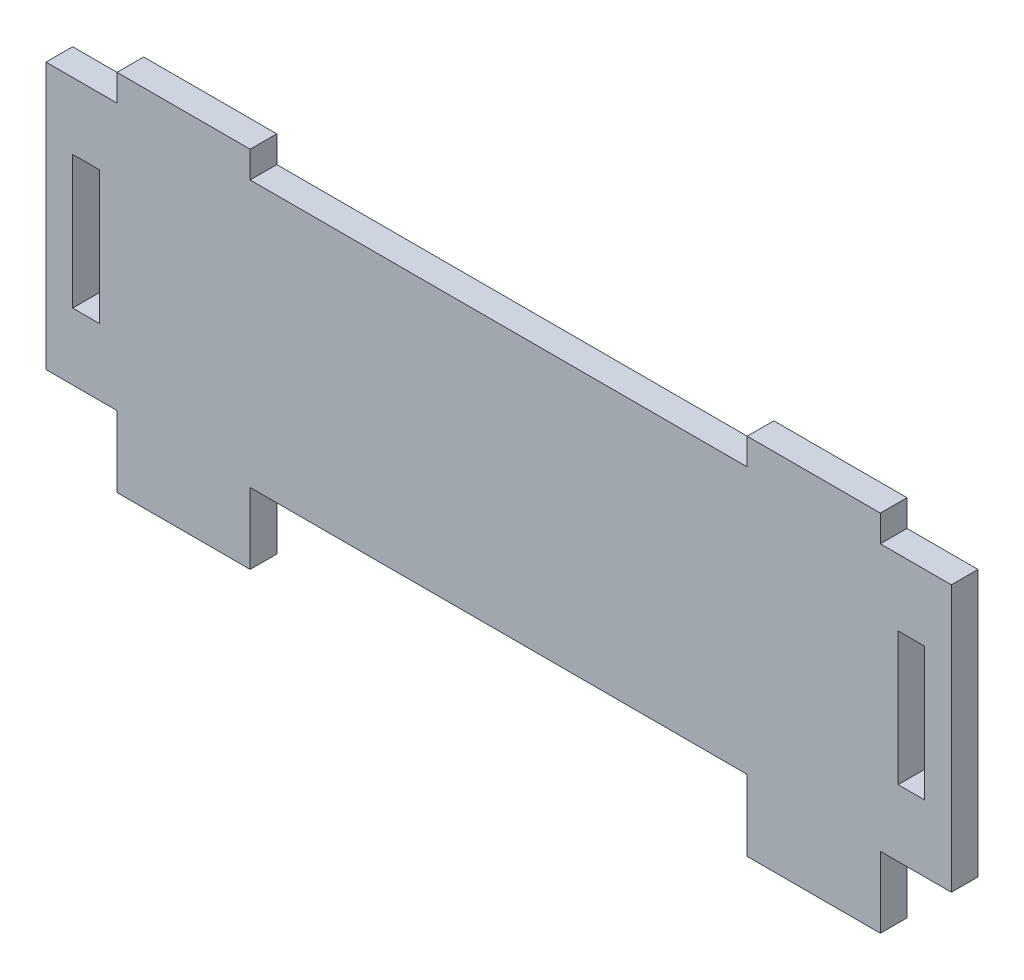
ISO-10303-21;
HEADER;
FILE_DESCRIPTION(('STEP AP214'),'2;1');
FILE_NAME('part.step','',(''),(''),'','','');
FILE_SCHEMA(('AUTOMOTIVE_DESIGN { 1 0 10303 214 1 1 1 1 }'));
ENDSEC;
DATA;
#1=APPLICATION_CONTEXT('core data for automotive mechanical design processes');
#2=APPLICATION_PROTOCOL_DEFINITION('international standard','automotive_design',2000,#1);
#3=PRODUCT_CONTEXT('',#1,'mechanical');
#4=PRODUCT('Part','Part','',(#3));
#5=PRODUCT_RELATED_PRODUCT_CATEGORY('part','',(#4));
#6=PRODUCT_DEFINITION_FORMATION('','',#4);
#7=PRODUCT_DEFINITION_CONTEXT('part definition',#1,'design');
#8=PRODUCT_DEFINITION('design','',#6,#7);
#9=PRODUCT_DEFINITION_SHAPE('','',#8);
#10=(LENGTH_UNIT() NAMED_UNIT(*) SI_UNIT(.MILLI.,.METRE.));
#11=(NAMED_UNIT(*) PLANE_ANGLE_UNIT() SI_UNIT($,.RADIAN.));
#12=(NAMED_UNIT(*) SI_UNIT($,.STERADIAN.) SOLID_ANGLE_UNIT());
#13=UNCERTAINTY_MEASURE_WITH_UNIT(LENGTH_MEASURE(1.E-05),#10,'distance_accuracy_value','');
#14=(GEOMETRIC_REPRESENTATION_CONTEXT(3) GLOBAL_UNCERTAINTY_ASSIGNED_CONTEXT((#13)) GLOBAL_UNIT_ASSIGNED_CONTEXT((#10,
#11,#12)) REPRESENTATION_CONTEXT('',''));
#15=CARTESIAN_POINT('',(0.,0.,0.));
#16=DIRECTION('',(0.,0.,1.));
#17=DIRECTION('',(1.,0.,0.));
#18=AXIS2_PLACEMENT_3D('',#15,#16,#17);
#19=CARTESIAN_POINT('',(-43.,-15.,3.));
#20=DIRECTION('',(0.,-1.,0.));
#21=DIRECTION('',(0.,0.,-1.));
#22=AXIS2_PLACEMENT_3D('',#19,#20,#21);
#23=PLANE('',#22);
#24=DIRECTION('',(-1.,0.,0.));
#25=VECTOR('',#24,1.);
#26=CARTESIAN_POINT('',(-43.,-15.,0.));
#27=LINE('',#26,#25);
#28=CARTESIAN_POINT('',(-43.,-15.,0.));
#29=VERTEX_POINT('',#28);
#30=CARTESIAN_POINT('',(-51.,-15.,0.));
#31=VERTEX_POINT('',#30);
#32=EDGE_CURVE('E421',#29,#31,#27,.T.);
#33=ORIENTED_EDGE('',*,*,#32,.F.);
#34=DIRECTION('',(0.,0.,-1.));
#35=VECTOR('',#34,1.);
#36=CARTESIAN_POINT('',(-43.,-15.,3.));
#37=LINE('',#36,#35);
#38=CARTESIAN_POINT('',(-43.,-15.,3.));
#39=VERTEX_POINT('',#38);
#40=EDGE_CURVE('E12',#39,#29,#37,.T.);
#41=ORIENTED_EDGE('',*,*,#40,.F.);
#42=DIRECTION('',(-1.,0.,0.));
#43=VECTOR('',#42,1.);
#44=CARTESIAN_POINT('',(-43.,-15.,3.));
#45=LINE('',#44,#43);
#46=CARTESIAN_POINT('',(-51.,-15.,3.));
#47=VERTEX_POINT('',#46);
#48=EDGE_CURVE('E428',#39,#47,#45,.T.);
#49=ORIENTED_EDGE('',*,*,#48,.T.);
#50=DIRECTION('',(0.,0.,-1.));
#51=VECTOR('',#50,1.);
#52=CARTESIAN_POINT('',(-51.,-15.,3.));
#53=LINE('',#52,#51);
#54=EDGE_CURVE('E180',#47,#31,#53,.T.);
#55=ORIENTED_EDGE('',*,*,#54,.T.);
#56=EDGE_LOOP('',(#33,#41,#49,#55));
#57=FACE_BOUND('',#56,.T.);
#58=ADVANCED_FACE('F177',(#57),#23,.T.);
#59=CARTESIAN_POINT('',(-43.,-23.,3.));
#60=DIRECTION('',(-1.,0.,0.));
#61=DIRECTION('',(0.,0.,1.));
#62=AXIS2_PLACEMENT_3D('',#59,#60,#61);
#63=PLANE('',#62);
#64=DIRECTION('',(0.,1.,0.));
#65=VECTOR('',#64,1.);
#66=CARTESIAN_POINT('',(-43.,-23.,0.));
#67=LINE('',#66,#65);
#68=CARTESIAN_POINT('',(-43.,-23.,0.));
#69=VERTEX_POINT('',#68);
#70=EDGE_CURVE('E432',#69,#29,#67,.T.);
#71=ORIENTED_EDGE('',*,*,#70,.F.);
#72=DIRECTION('',(0.,0.,-1.));
#73=VECTOR('',#72,1.);
#74=CARTESIAN_POINT('',(-43.,-23.,3.));
#75=LINE('',#74,#73);
#76=CARTESIAN_POINT('',(-43.,-23.,3.));
#77=VERTEX_POINT('',#76);
#78=EDGE_CURVE('E185',#77,#69,#75,.T.);
#79=ORIENTED_EDGE('',*,*,#78,.F.);
#80=DIRECTION('',(0.,1.,0.));
#81=VECTOR('',#80,1.);
#82=CARTESIAN_POINT('',(-43.,-23.,3.));
#83=LINE('',#82,#81);
#84=EDGE_CURVE('E484',#77,#39,#83,.T.);
#85=ORIENTED_EDGE('',*,*,#84,.T.);
#86=ORIENTED_EDGE('',*,*,#40,.T.);
#87=EDGE_LOOP('',(#71,#79,#85,#86));
#88=FACE_BOUND('',#87,.T.);
#89=ADVANCED_FACE('F591',(#88),#63,.T.);
#90=CARTESIAN_POINT('',(-43.,-23.,3.));
#91=DIRECTION('',(0.,1.,0.));
#92=DIRECTION('',(0.,0.,1.));
#93=AXIS2_PLACEMENT_3D('',#90,#91,#92);
#94=PLANE('',#93);
#95=DIRECTION('',(1.,0.,0.));
#96=VECTOR('',#95,1.);
#97=CARTESIAN_POINT('',(-43.,-23.,0.));
#98=LINE('',#97,#96);
#99=CARTESIAN_POINT('',(-28.,-23.,0.));
#100=VERTEX_POINT('',#99);
#101=EDGE_CURVE('E540',#69,#100,#98,.T.);
#102=ORIENTED_EDGE('',*,*,#101,.T.);
#103=DIRECTION('',(0.,0.,-1.));
#104=VECTOR('',#103,1.);
#105=CARTESIAN_POINT('',(-28.,-23.,3.));
#106=LINE('',#105,#104);
#107=CARTESIAN_POINT('',(-28.,-23.,3.));
#108=VERTEX_POINT('',#107);
#109=EDGE_CURVE('E546',#108,#100,#106,.T.);
#110=ORIENTED_EDGE('',*,*,#109,.F.);
#111=DIRECTION('',(1.,0.,0.));
#112=VECTOR('',#111,1.);
#113=CARTESIAN_POINT('',(-43.,-23.,3.));
#114=LINE('',#113,#112);
#115=EDGE_CURVE('E482',#77,#108,#114,.T.);
#116=ORIENTED_EDGE('',*,*,#115,.F.);
#117=ORIENTED_EDGE('',*,*,#78,.T.);
#118=EDGE_LOOP('',(#102,#110,#116,#117));
#119=FACE_BOUND('',#118,.T.);
#120=ADVANCED_FACE('F661',(#119),#94,.F.);
#121=CARTESIAN_POINT('',(-28.,-15.,3.));
#122=DIRECTION('',(1.,0.,0.));
#123=DIRECTION('',(0.,1.,0.));
#124=AXIS2_PLACEMENT_3D('',#121,#122,#123);
#125=PLANE('',#124);
#126=DIRECTION('',(0.,-1.,0.));
#127=VECTOR('',#126,1.);
#128=CARTESIAN_POINT('',(-28.,-15.,0.));
#129=LINE('',#128,#127);
#130=CARTESIAN_POINT('',(-28.,-15.,0.));
#131=VERTEX_POINT('',#130);
#132=EDGE_CURVE('E537',#131,#100,#129,.T.);
#133=ORIENTED_EDGE('',*,*,#132,.F.);
#134=DIRECTION('',(0.,0.,-1.));
#135=VECTOR('',#134,1.);
#136=CARTESIAN_POINT('',(-28.,-15.,3.));
#137=LINE('',#136,#135);
#138=CARTESIAN_POINT('',(-28.,-15.,3.));
#139=VERTEX_POINT('',#138);
#140=EDGE_CURVE('E548',#139,#131,#137,.T.);
#141=ORIENTED_EDGE('',*,*,#140,.F.);
#142=DIRECTION('',(0.,-1.,0.));
#143=VECTOR('',#142,1.);
#144=CARTESIAN_POINT('',(-28.,-15.,3.));
#145=LINE('',#144,#143);
#146=EDGE_CURVE('E479',#139,#108,#145,.T.);
#147=ORIENTED_EDGE('',*,*,#146,.T.);
#148=ORIENTED_EDGE('',*,*,#109,.T.);
#149=EDGE_LOOP('',(#133,#141,#147,#148));
#150=FACE_BOUND('',#149,.T.);
#151=ADVANCED_FACE('F657',(#150),#125,.T.);
#152=CARTESIAN_POINT('',(28.,-15.,3.));
#153=DIRECTION('',(0.,-1.,0.));
#154=DIRECTION('',(1.,0.,0.));
#155=AXIS2_PLACEMENT_3D('',#152,#153,#154);
#156=PLANE('',#155);
#157=DIRECTION('',(-1.,0.,0.));
#158=VECTOR('',#157,1.);
#159=CARTESIAN_POINT('',(28.,-15.,0.));
#160=LINE('',#159,#158);
#161=CARTESIAN_POINT('',(28.,-15.,0.));
#162=VERTEX_POINT('',#161);
#163=EDGE_CURVE('E534',#162,#131,#160,.T.);
#164=ORIENTED_EDGE('',*,*,#163,.F.);
#165=DIRECTION('',(0.,0.,-1.));
#166=VECTOR('',#165,1.);
#167=CARTESIAN_POINT('',(28.,-15.,3.));
#168=LINE('',#167,#166);
#169=CARTESIAN_POINT('',(28.,-15.,3.));
#170=VERTEX_POINT('',#169);
#171=EDGE_CURVE('E550',#170,#162,#168,.T.);
#172=ORIENTED_EDGE('',*,*,#171,.F.);
#173=DIRECTION('',(-1.,0.,0.));
#174=VECTOR('',#173,1.);
#175=CARTESIAN_POINT('',(28.,-15.,3.));
#176=LINE('',#175,#174);
#177=EDGE_CURVE('E476',#170,#139,#176,.T.);
#178=ORIENTED_EDGE('',*,*,#177,.T.);
#179=ORIENTED_EDGE('',*,*,#140,.T.);
#180=EDGE_LOOP('',(#164,#172,#178,#179));
#181=FACE_BOUND('',#180,.T.);
#182=ADVANCED_FACE('F654',(#181),#156,.T.);
#183=CARTESIAN_POINT('',(28.,-23.,3.));
#184=DIRECTION('',(-1.,0.,0.));
#185=DIRECTION('',(0.,0.,1.));
#186=AXIS2_PLACEMENT_3D('',#183,#184,#185);
#187=PLANE('',#186);
#188=DIRECTION('',(0.,1.,0.));
#189=VECTOR('',#188,1.);
#190=CARTESIAN_POINT('',(28.,-23.,0.));
#191=LINE('',#190,#189);
#192=CARTESIAN_POINT('',(28.,-23.,0.));
#193=VERTEX_POINT('',#192);
#194=EDGE_CURVE('E531',#193,#162,#191,.T.);
#195=ORIENTED_EDGE('',*,*,#194,.F.);
#196=DIRECTION('',(0.,0.,-1.));
#197=VECTOR('',#196,1.);
#198=CARTESIAN_POINT('',(28.,-23.,3.));
#199=LINE('',#198,#197);
#200=CARTESIAN_POINT('',(28.,-23.,3.));
#201=VERTEX_POINT('',#200);
#202=EDGE_CURVE('E552',#201,#193,#199,.T.);
#203=ORIENTED_EDGE('',*,*,#202,.F.);
#204=DIRECTION('',(0.,1.,0.));
#205=VECTOR('',#204,1.);
#206=CARTESIAN_POINT('',(28.,-23.,3.));
#207=LINE('',#206,#205);
#208=EDGE_CURVE('E473',#201,#170,#207,.T.);
#209=ORIENTED_EDGE('',*,*,#208,.T.);
#210=ORIENTED_EDGE('',*,*,#171,.T.);
#211=EDGE_LOOP('',(#195,#203,#209,#210));
#212=FACE_BOUND('',#211,.T.);
#213=ADVANCED_FACE('F650',(#212),#187,.T.);
#214=CARTESIAN_POINT('',(43.,-23.,3.));
#215=DIRECTION('',(0.,-1.,0.));
#216=DIRECTION('',(0.,0.,-1.));
#217=AXIS2_PLACEMENT_3D('',#214,#215,#216);
#218=PLANE('',#217);
#219=DIRECTION('',(-1.,0.,0.));
#220=VECTOR('',#219,1.);
#221=CARTESIAN_POINT('',(43.,-23.,0.));
#222=LINE('',#221,#220);
#223=CARTESIAN_POINT('',(43.,-23.,0.));
#224=VERTEX_POINT('',#223);
#225=EDGE_CURVE('E528',#224,#193,#222,.T.);
#226=ORIENTED_EDGE('',*,*,#225,.F.);
#227=DIRECTION('',(0.,0.,-1.));
#228=VECTOR('',#227,1.);
#229=CARTESIAN_POINT('',(43.,-23.,3.));
#230=LINE('',#229,#228);
#231=CARTESIAN_POINT('',(43.,-23.,3.));
#232=VERTEX_POINT('',#231);
#233=EDGE_CURVE('E554',#232,#224,#230,.T.);
#234=ORIENTED_EDGE('',*,*,#233,.F.);
#235=DIRECTION('',(-1.,0.,0.));
#236=VECTOR('',#235,1.);
#237=CARTESIAN_POINT('',(43.,-23.,3.));
#238=LINE('',#237,#236);
#239=EDGE_CURVE('E470',#232,#201,#238,.T.);
#240=ORIENTED_EDGE('',*,*,#239,.T.);
#241=ORIENTED_EDGE('',*,*,#202,.T.);
#242=EDGE_LOOP('',(#226,#234,#240,#241));
#243=FACE_BOUND('',#242,.T.);
#244=ADVANCED_FACE('F646',(#243),#218,.T.);
#245=CARTESIAN_POINT('',(43.,-15.,3.));
#246=DIRECTION('',(1.,0.,0.));
#247=DIRECTION('',(0.,0.,-1.));
#248=AXIS2_PLACEMENT_3D('',#245,#246,#247);
#249=PLANE('',#248);
#250=DIRECTION('',(0.,-1.,0.));
#251=VECTOR('',#250,1.);
#252=CARTESIAN_POINT('',(43.,-15.,0.));
#253=LINE('',#252,#251);
#254=CARTESIAN_POINT('',(43.,-15.,0.));
#255=VERTEX_POINT('',#254);
#256=EDGE_CURVE('E525',#255,#224,#253,.T.);
#257=ORIENTED_EDGE('',*,*,#256,.F.);
#258=DIRECTION('',(0.,0.,-1.));
#259=VECTOR('',#258,1.);
#260=CARTESIAN_POINT('',(43.,-15.,3.));
#261=LINE('',#260,#259);
#262=CARTESIAN_POINT('',(43.,-15.,3.));
#263=VERTEX_POINT('',#262);
#264=EDGE_CURVE('E556',#263,#255,#261,.T.);
#265=ORIENTED_EDGE('',*,*,#264,.F.);
#266=DIRECTION('',(0.,-1.,0.));
#267=VECTOR('',#266,1.);
#268=CARTESIAN_POINT('',(43.,-15.,3.));
#269=LINE('',#268,#267);
#270=EDGE_CURVE('E467',#263,#232,#269,.T.);
#271=ORIENTED_EDGE('',*,*,#270,.T.);
#272=ORIENTED_EDGE('',*,*,#233,.T.);
#273=EDGE_LOOP('',(#257,#265,#271,#272));
#274=FACE_BOUND('',#273,.T.);
#275=ADVANCED_FACE('F642',(#274),#249,.T.);
#276=CARTESIAN_POINT('',(51.,-15.,3.));
#277=DIRECTION('',(0.,-1.,0.));
#278=DIRECTION('',(1.,0.,0.));
#279=AXIS2_PLACEMENT_3D('',#276,#277,#278);
#280=PLANE('',#279);
#281=DIRECTION('',(-1.,0.,0.));
#282=VECTOR('',#281,1.);
#283=CARTESIAN_POINT('',(51.,-15.,0.));
#284=LINE('',#283,#282);
#285=CARTESIAN_POINT('',(51.,-15.,0.));
#286=VERTEX_POINT('',#285);
#287=EDGE_CURVE('E522',#286,#255,#284,.T.);
#288=ORIENTED_EDGE('',*,*,#287,.F.);
#289=DIRECTION('',(0.,0.,-1.));
#290=VECTOR('',#289,1.);
#291=CARTESIAN_POINT('',(51.,-15.,3.));
#292=LINE('',#291,#290);
#293=CARTESIAN_POINT('',(51.,-15.,3.));
#294=VERTEX_POINT('',#293);
#295=EDGE_CURVE('E558',#294,#286,#292,.T.);
#296=ORIENTED_EDGE('',*,*,#295,.F.);
#297=DIRECTION('',(-1.,0.,0.));
#298=VECTOR('',#297,1.);
#299=CARTESIAN_POINT('',(51.,-15.,3.));
#300=LINE('',#299,#298);
#301=EDGE_CURVE('E464',#294,#263,#300,.T.);
#302=ORIENTED_EDGE('',*,*,#301,.T.);
#303=ORIENTED_EDGE('',*,*,#264,.T.);
#304=EDGE_LOOP('',(#288,#296,#302,#303));
#305=FACE_BOUND('',#304,.T.);
#306=ADVANCED_FACE('F637',(#305),#280,.T.);
#307=CARTESIAN_POINT('',(51.,-15.,3.));
#308=DIRECTION('',(-1.,0.,0.));
#309=DIRECTION('',(0.,0.,1.));
#310=AXIS2_PLACEMENT_3D('',#307,#308,#309);
#311=PLANE('',#310);
#312=DIRECTION('',(0.,1.,0.));
#313=VECTOR('',#312,1.);
#314=CARTESIAN_POINT('',(51.,-15.,0.));
#315=LINE('',#314,#313);
#316=CARTESIAN_POINT('',(51.,15.,0.));
#317=VERTEX_POINT('',#316);
#318=EDGE_CURVE('E519',#286,#317,#315,.T.);
#319=ORIENTED_EDGE('',*,*,#318,.T.);
#320=DIRECTION('',(0.,0.,-1.));
#321=VECTOR('',#320,1.);
#322=CARTESIAN_POINT('',(51.,15.,3.));
#323=LINE('',#322,#321);
#324=CARTESIAN_POINT('',(51.,15.,3.));
#325=VERTEX_POINT('',#324);
#326=EDGE_CURVE('E560',#325,#317,#323,.T.);
#327=ORIENTED_EDGE('',*,*,#326,.F.);
#328=DIRECTION('',(0.,1.,0.));
#329=VECTOR('',#328,1.);
#330=CARTESIAN_POINT('',(51.,-15.,3.));
#331=LINE('',#330,#329);
#332=EDGE_CURVE('E462',#294,#325,#331,.T.);
#333=ORIENTED_EDGE('',*,*,#332,.F.);
#334=ORIENTED_EDGE('',*,*,#295,.T.);
#335=EDGE_LOOP('',(#319,#327,#333,#334));
#336=FACE_BOUND('',#335,.T.);
#337=ADVANCED_FACE('F634',(#336),#311,.F.);
#338=CARTESIAN_POINT('',(43.,15.,3.));
#339=DIRECTION('',(0.,1.,0.));
#340=DIRECTION('',(-1.,0.,0.));
#341=AXIS2_PLACEMENT_3D('',#338,#339,#340);
#342=PLANE('',#341);
#343=DIRECTION('',(1.,0.,0.));
#344=VECTOR('',#343,1.);
#345=CARTESIAN_POINT('',(43.,15.,0.));
#346=LINE('',#345,#344);
#347=CARTESIAN_POINT('',(43.,15.,0.));
#348=VERTEX_POINT('',#347);
#349=EDGE_CURVE('E516',#348,#317,#346,.T.);
#350=ORIENTED_EDGE('',*,*,#349,.F.);
#351=DIRECTION('',(0.,0.,-1.));
#352=VECTOR('',#351,1.);
#353=CARTESIAN_POINT('',(43.,15.,3.));
#354=LINE('',#353,#352);
#355=CARTESIAN_POINT('',(43.,15.,3.));
#356=VERTEX_POINT('',#355);
#357=EDGE_CURVE('E562',#356,#348,#354,.T.);
#358=ORIENTED_EDGE('',*,*,#357,.F.);
#359=DIRECTION('',(1.,0.,0.));
#360=VECTOR('',#359,1.);
#361=CARTESIAN_POINT('',(43.,15.,3.));
#362=LINE('',#361,#360);
#363=EDGE_CURVE('E459',#356,#325,#362,.T.);
#364=ORIENTED_EDGE('',*,*,#363,.T.);
#365=ORIENTED_EDGE('',*,*,#326,.T.);
#366=EDGE_LOOP('',(#350,#358,#364,#365));
#367=FACE_BOUND('',#366,.T.);
#368=ADVANCED_FACE('F630',(#367),#342,.T.);
#369=CARTESIAN_POINT('',(43.,18.,3.));
#370=DIRECTION('',(1.,0.,0.));
#371=DIRECTION('',(0.,0.,-1.));
#372=AXIS2_PLACEMENT_3D('',#369,#370,#371);
#373=PLANE('',#372);
#374=DIRECTION('',(0.,-1.,0.));
#375=VECTOR('',#374,1.);
#376=CARTESIAN_POINT('',(43.,18.,0.));
#377=LINE('',#376,#375);
#378=CARTESIAN_POINT('',(43.,18.,0.));
#379=VERTEX_POINT('',#378);
#380=EDGE_CURVE('E513',#379,#348,#377,.T.);
#381=ORIENTED_EDGE('',*,*,#380,.F.);
#382=DIRECTION('',(0.,0.,-1.));
#383=VECTOR('',#382,1.);
#384=CARTESIAN_POINT('',(43.,18.,3.));
#385=LINE('',#384,#383);
#386=CARTESIAN_POINT('',(43.,18.,3.));
#387=VERTEX_POINT('',#386);
#388=EDGE_CURVE('E564',#387,#379,#385,.T.);
#389=ORIENTED_EDGE('',*,*,#388,.F.);
#390=DIRECTION('',(0.,-1.,0.));
#391=VECTOR('',#390,1.);
#392=CARTESIAN_POINT('',(43.,18.,3.));
#393=LINE('',#392,#391);
#394=EDGE_CURVE('E456',#387,#356,#393,.T.);
#395=ORIENTED_EDGE('',*,*,#394,.T.);
#396=ORIENTED_EDGE('',*,*,#357,.T.);
#397=EDGE_LOOP('',(#381,#389,#395,#396));
#398=FACE_BOUND('',#397,.T.);
#399=ADVANCED_FACE('F626',(#398),#373,.T.);
#400=CARTESIAN_POINT('',(28.,18.,3.));
#401=DIRECTION('',(0.,1.,0.));
#402=DIRECTION('',(0.,0.,1.));
#403=AXIS2_PLACEMENT_3D('',#400,#401,#402);
#404=PLANE('',#403);
#405=DIRECTION('',(1.,0.,0.));
#406=VECTOR('',#405,1.);
#407=CARTESIAN_POINT('',(28.,18.,0.));
#408=LINE('',#407,#406);
#409=CARTESIAN_POINT('',(28.,18.,0.));
#410=VERTEX_POINT('',#409);
#411=EDGE_CURVE('E510',#410,#379,#408,.T.);
#412=ORIENTED_EDGE('',*,*,#411,.F.);
#413=DIRECTION('',(0.,0.,-1.));
#414=VECTOR('',#413,1.);
#415=CARTESIAN_POINT('',(28.,18.,3.));
#416=LINE('',#415,#414);
#417=CARTESIAN_POINT('',(28.,18.,3.));
#418=VERTEX_POINT('',#417);
#419=EDGE_CURVE('E566',#418,#410,#416,.T.);
#420=ORIENTED_EDGE('',*,*,#419,.F.);
#421=DIRECTION('',(1.,0.,0.));
#422=VECTOR('',#421,1.);
#423=CARTESIAN_POINT('',(28.,18.,3.));
#424=LINE('',#423,#422);
#425=EDGE_CURVE('E453',#418,#387,#424,.T.);
#426=ORIENTED_EDGE('',*,*,#425,.T.);
#427=ORIENTED_EDGE('',*,*,#388,.T.);
#428=EDGE_LOOP('',(#412,#420,#426,#427));
#429=FACE_BOUND('',#428,.T.);
#430=ADVANCED_FACE('F621',(#429),#404,.T.);
#431=CARTESIAN_POINT('',(28.,15.,3.));
#432=DIRECTION('',(-1.,0.,0.));
#433=DIRECTION('',(0.,0.,1.));
#434=AXIS2_PLACEMENT_3D('',#431,#432,#433);
#435=PLANE('',#434);
#436=DIRECTION('',(0.,1.,0.));
#437=VECTOR('',#436,1.);
#438=CARTESIAN_POINT('',(28.,15.,0.));
#439=LINE('',#438,#437);
#440=CARTESIAN_POINT('',(28.,15.,0.));
#441=VERTEX_POINT('',#440);
#442=EDGE_CURVE('E507',#441,#410,#439,.T.);
#443=ORIENTED_EDGE('',*,*,#442,.F.);
#444=DIRECTION('',(0.,0.,-1.));
#445=VECTOR('',#444,1.);
#446=CARTESIAN_POINT('',(28.,15.,3.));
#447=LINE('',#446,#445);
#448=CARTESIAN_POINT('',(28.,15.,3.));
#449=VERTEX_POINT('',#448);
#450=EDGE_CURVE('E568',#449,#441,#447,.T.);
#451=ORIENTED_EDGE('',*,*,#450,.F.);
#452=DIRECTION('',(0.,1.,0.));
#453=VECTOR('',#452,1.);
#454=CARTESIAN_POINT('',(28.,15.,3.));
#455=LINE('',#454,#453);
#456=EDGE_CURVE('E450',#449,#418,#455,.T.);
#457=ORIENTED_EDGE('',*,*,#456,.T.);
#458=ORIENTED_EDGE('',*,*,#419,.T.);
#459=EDGE_LOOP('',(#443,#451,#457,#458));
#460=FACE_BOUND('',#459,.T.);
#461=ADVANCED_FACE('F617',(#460),#435,.T.);
#462=CARTESIAN_POINT('',(-28.,15.,3.));
#463=DIRECTION('',(0.,1.,0.));
#464=DIRECTION('',(0.,0.,1.));
#465=AXIS2_PLACEMENT_3D('',#462,#463,#464);
#466=PLANE('',#465);
#467=DIRECTION('',(1.,0.,0.));
#468=VECTOR('',#467,1.);
#469=CARTESIAN_POINT('',(-28.,15.,0.));
#470=LINE('',#469,#468);
#471=CARTESIAN_POINT('',(-28.,15.,0.));
#472=VERTEX_POINT('',#471);
#473=EDGE_CURVE('E504',#472,#441,#470,.T.);
#474=ORIENTED_EDGE('',*,*,#473,.F.);
#475=DIRECTION('',(0.,0.,-1.));
#476=VECTOR('',#475,1.);
#477=CARTESIAN_POINT('',(-28.,15.,3.));
#478=LINE('',#477,#476);
#479=CARTESIAN_POINT('',(-28.,15.,3.));
#480=VERTEX_POINT('',#479);
#481=EDGE_CURVE('E570',#480,#472,#478,.T.);
#482=ORIENTED_EDGE('',*,*,#481,.F.);
#483=DIRECTION('',(1.,0.,0.));
#484=VECTOR('',#483,1.);
#485=CARTESIAN_POINT('',(-28.,15.,3.));
#486=LINE('',#485,#484);
#487=EDGE_CURVE('E447',#480,#449,#486,.T.);
#488=ORIENTED_EDGE('',*,*,#487,.T.);
#489=ORIENTED_EDGE('',*,*,#450,.T.);
#490=EDGE_LOOP('',(#474,#482,#488,#489));
#491=FACE_BOUND('',#490,.T.);
#492=ADVANCED_FACE('F613',(#491),#466,.T.);
#493=CARTESIAN_POINT('',(-28.,18.,3.));
#494=DIRECTION('',(1.,0.,0.));
#495=DIRECTION('',(0.,0.,-1.));
#496=AXIS2_PLACEMENT_3D('',#493,#494,#495);
#497=PLANE('',#496);
#498=DIRECTION('',(0.,-1.,0.));
#499=VECTOR('',#498,1.);
#500=CARTESIAN_POINT('',(-28.,18.,0.));
#501=LINE('',#500,#499);
#502=CARTESIAN_POINT('',(-28.,18.,0.));
#503=VERTEX_POINT('',#502);
#504=EDGE_CURVE('E501',#503,#472,#501,.T.);
#505=ORIENTED_EDGE('',*,*,#504,.F.);
#506=DIRECTION('',(0.,0.,-1.));
#507=VECTOR('',#506,1.);
#508=CARTESIAN_POINT('',(-28.,18.,3.));
#509=LINE('',#508,#507);
#510=CARTESIAN_POINT('',(-28.,18.,3.));
#511=VERTEX_POINT('',#510);
#512=EDGE_CURVE('E572',#511,#503,#509,.T.);
#513=ORIENTED_EDGE('',*,*,#512,.F.);
#514=DIRECTION('',(0.,-1.,0.));
#515=VECTOR('',#514,1.);
#516=CARTESIAN_POINT('',(-28.,18.,3.));
#517=LINE('',#516,#515);
#518=EDGE_CURVE('E444',#511,#480,#517,.T.);
#519=ORIENTED_EDGE('',*,*,#518,.T.);
#520=ORIENTED_EDGE('',*,*,#481,.T.);
#521=EDGE_LOOP('',(#505,#513,#519,#520));
#522=FACE_BOUND('',#521,.T.);
#523=ADVANCED_FACE('F609',(#522),#497,.T.);
#524=CARTESIAN_POINT('',(-43.,18.,3.));
#525=DIRECTION('',(0.,1.,0.));
#526=DIRECTION('',(0.,0.,1.));
#527=AXIS2_PLACEMENT_3D('',#524,#525,#526);
#528=PLANE('',#527);
#529=DIRECTION('',(1.,0.,0.));
#530=VECTOR('',#529,1.);
#531=CARTESIAN_POINT('',(-43.,18.,0.));
#532=LINE('',#531,#530);
#533=CARTESIAN_POINT('',(-43.,18.,0.));
#534=VERTEX_POINT('',#533);
#535=EDGE_CURVE('E498',#534,#503,#532,.T.);
#536=ORIENTED_EDGE('',*,*,#535,.F.);
#537=DIRECTION('',(0.,0.,-1.));
#538=VECTOR('',#537,1.);
#539=CARTESIAN_POINT('',(-43.,18.,3.));
#540=LINE('',#539,#538);
#541=CARTESIAN_POINT('',(-43.,18.,3.));
#542=VERTEX_POINT('',#541);
#543=EDGE_CURVE('E574',#542,#534,#540,.T.);
#544=ORIENTED_EDGE('',*,*,#543,.F.);
#545=DIRECTION('',(1.,0.,0.));
#546=VECTOR('',#545,1.);
#547=CARTESIAN_POINT('',(-43.,18.,3.));
#548=LINE('',#547,#546);
#549=EDGE_CURVE('E441',#542,#511,#548,.T.);
#550=ORIENTED_EDGE('',*,*,#549,.T.);
#551=ORIENTED_EDGE('',*,*,#512,.T.);
#552=EDGE_LOOP('',(#536,#544,#550,#551));
#553=FACE_BOUND('',#552,.T.);
#554=ADVANCED_FACE('F605',(#553),#528,.T.);
#555=CARTESIAN_POINT('',(-43.,15.,3.));
#556=DIRECTION('',(-1.,0.,0.));
#557=DIRECTION('',(0.,0.,1.));
#558=AXIS2_PLACEMENT_3D('',#555,#556,#557);
#559=PLANE('',#558);
#560=DIRECTION('',(0.,1.,0.));
#561=VECTOR('',#560,1.);
#562=CARTESIAN_POINT('',(-43.,15.,0.));
#563=LINE('',#562,#561);
#564=CARTESIAN_POINT('',(-43.,15.,0.));
#565=VERTEX_POINT('',#564);
#566=EDGE_CURVE('E495',#565,#534,#563,.T.);
#567=ORIENTED_EDGE('',*,*,#566,.F.);
#568=DIRECTION('',(0.,0.,-1.));
#569=VECTOR('',#568,1.);
#570=CARTESIAN_POINT('',(-43.,15.,3.));
#571=LINE('',#570,#569);
#572=CARTESIAN_POINT('',(-43.,15.,3.));
#573=VERTEX_POINT('',#572);
#574=EDGE_CURVE('E576',#573,#565,#571,.T.);
#575=ORIENTED_EDGE('',*,*,#574,.F.);
#576=DIRECTION('',(0.,1.,0.));
#577=VECTOR('',#576,1.);
#578=CARTESIAN_POINT('',(-43.,15.,3.));
#579=LINE('',#578,#577);
#580=EDGE_CURVE('E438',#573,#542,#579,.T.);
#581=ORIENTED_EDGE('',*,*,#580,.T.);
#582=ORIENTED_EDGE('',*,*,#543,.T.);
#583=EDGE_LOOP('',(#567,#575,#581,#582));
#584=FACE_BOUND('',#583,.T.);
#585=ADVANCED_FACE('F603',(#584),#559,.T.);
#586=CARTESIAN_POINT('',(-51.,15.,3.));
#587=DIRECTION('',(0.,1.,0.));
#588=DIRECTION('',(0.,0.,1.));
#589=AXIS2_PLACEMENT_3D('',#586,#587,#588);
#590=PLANE('',#589);
#591=DIRECTION('',(1.,0.,0.));
#592=VECTOR('',#591,1.);
#593=CARTESIAN_POINT('',(-51.,15.,0.));
#594=LINE('',#593,#592);
#595=CARTESIAN_POINT('',(-51.,15.,0.));
#596=VERTEX_POINT('',#595);
#597=EDGE_CURVE('E492',#596,#565,#594,.T.);
#598=ORIENTED_EDGE('',*,*,#597,.F.);
#599=DIRECTION('',(0.,0.,-1.));
#600=VECTOR('',#599,1.);
#601=CARTESIAN_POINT('',(-51.,15.,3.));
#602=LINE('',#601,#600);
#603=CARTESIAN_POINT('',(-51.,15.,3.));
#604=VERTEX_POINT('',#603);
#605=EDGE_CURVE('E577',#604,#596,#602,.T.);
#606=ORIENTED_EDGE('',*,*,#605,.F.);
#607=DIRECTION('',(1.,0.,0.));
#608=VECTOR('',#607,1.);
#609=CARTESIAN_POINT('',(-51.,15.,3.));
#610=LINE('',#609,#608);
#611=EDGE_CURVE('E435',#604,#573,#610,.T.);
#612=ORIENTED_EDGE('',*,*,#611,.T.);
#613=ORIENTED_EDGE('',*,*,#574,.T.);
#614=EDGE_LOOP('',(#598,#606,#612,#613));
#615=FACE_BOUND('',#614,.T.);
#616=ADVANCED_FACE('F599',(#615),#590,.T.);
#617=CARTESIAN_POINT('',(-51.,-15.,3.));
#618=DIRECTION('',(-1.,0.,0.));
#619=DIRECTION('',(0.,0.,1.));
#620=AXIS2_PLACEMENT_3D('',#617,#618,#619);
#621=PLANE('',#620);
#622=DIRECTION('',(0.,1.,0.));
#623=VECTOR('',#622,1.);
#624=CARTESIAN_POINT('',(-51.,-15.,0.));
#625=LINE('',#624,#623);
#626=EDGE_CURVE('E489',#31,#596,#625,.T.);
#627=ORIENTED_EDGE('',*,*,#626,.F.);
#628=ORIENTED_EDGE('',*,*,#54,.F.);
#629=DIRECTION('',(0.,1.,0.));
#630=VECTOR('',#629,1.);
#631=CARTESIAN_POINT('',(-51.,-15.,3.));
#632=LINE('',#631,#630);
#633=EDGE_CURVE('E431',#47,#604,#632,.T.);
#634=ORIENTED_EDGE('',*,*,#633,.T.);
#635=ORIENTED_EDGE('',*,*,#605,.T.);
#636=EDGE_LOOP('',(#627,#628,#634,#635));
#637=FACE_BOUND('',#636,.T.);
#638=ADVANCED_FACE('F585',(#637),#621,.T.);
#639=CARTESIAN_POINT('',(0.,0.,3.));
#640=DIRECTION('',(0.,0.,-1.));
#641=DIRECTION('',(-1.,0.,0.));
#642=AXIS2_PLACEMENT_3D('',#639,#640,#641);
#643=PLANE('',#642);
#644=DIRECTION('',(0.,-1.,0.));
#645=VECTOR('',#644,1.);
#646=CARTESIAN_POINT('',(45.,7.5,3.));
#647=LINE('',#646,#645);
#648=CARTESIAN_POINT('',(45.,7.5,3.));
#649=VERTEX_POINT('',#648);
#650=CARTESIAN_POINT('',(45.,-7.5,3.));
#651=VERTEX_POINT('',#650);
#652=EDGE_CURVE('E367',#649,#651,#647,.T.);
#653=ORIENTED_EDGE('',*,*,#652,.F.);
#654=DIRECTION('',(1.,0.,0.));
#655=VECTOR('',#654,1.);
#656=CARTESIAN_POINT('',(45.,7.5,3.));
#657=LINE('',#656,#655);
#658=CARTESIAN_POINT('',(48.,7.5,3.));
#659=VERTEX_POINT('',#658);
#660=EDGE_CURVE('E364',#649,#659,#657,.T.);
#661=ORIENTED_EDGE('',*,*,#660,.T.);
#662=DIRECTION('',(0.,-1.,0.));
#663=VECTOR('',#662,1.);
#664=CARTESIAN_POINT('',(48.,7.5,3.));
#665=LINE('',#664,#663);
#666=CARTESIAN_POINT('',(48.,-7.5,3.));
#667=VERTEX_POINT('',#666);
#668=EDGE_CURVE('E370',#659,#667,#665,.T.);
#669=ORIENTED_EDGE('',*,*,#668,.T.);
#670=DIRECTION('',(1.,0.,0.));
#671=VECTOR('',#670,1.);
#672=CARTESIAN_POINT('',(45.,-7.5,3.));
#673=LINE('',#672,#671);
#674=EDGE_CURVE('E374',#651,#667,#673,.T.);
#675=ORIENTED_EDGE('',*,*,#674,.F.);
#676=EDGE_LOOP('',(#653,#661,#669,#675));
#677=FACE_BOUND('',#676,.T.);
#678=DIRECTION('',(0.,-1.,0.));
#679=VECTOR('',#678,1.);
#680=CARTESIAN_POINT('',(-48.,7.5,3.));
#681=LINE('',#680,#679);
#682=CARTESIAN_POINT('',(-48.,7.5,3.));
#683=VERTEX_POINT('',#682);
#684=CARTESIAN_POINT('',(-48.,-7.5,3.));
#685=VERTEX_POINT('',#684);
#686=EDGE_CURVE('E407',#683,#685,#681,.T.);
#687=ORIENTED_EDGE('',*,*,#686,.F.);
#688=DIRECTION('',(1.,0.,0.));
#689=VECTOR('',#688,1.);
#690=CARTESIAN_POINT('',(-48.,7.5,3.));
#691=LINE('',#690,#689);
#692=CARTESIAN_POINT('',(-45.,7.5,3.));
#693=VERTEX_POINT('',#692);
#694=EDGE_CURVE('E397',#683,#693,#691,.T.);
#695=ORIENTED_EDGE('',*,*,#694,.T.);
#696=DIRECTION('',(0.,-1.,0.));
#697=VECTOR('',#696,1.);
#698=CARTESIAN_POINT('',(-45.,7.5,3.));
#699=LINE('',#698,#697);
#700=CARTESIAN_POINT('',(-45.,-7.5,3.));
#701=VERTEX_POINT('',#700);
#702=EDGE_CURVE('E400',#693,#701,#699,.T.);
#703=ORIENTED_EDGE('',*,*,#702,.T.);
#704=DIRECTION('',(1.,0.,0.));
#705=VECTOR('',#704,1.);
#706=CARTESIAN_POINT('',(-48.,-7.5,3.));
#707=LINE('',#706,#705);
#708=EDGE_CURVE('E404',#685,#701,#707,.T.);
#709=ORIENTED_EDGE('',*,*,#708,.F.);
#710=EDGE_LOOP('',(#687,#695,#703,#709));
#711=FACE_BOUND('',#710,.T.);
#712=ORIENTED_EDGE('',*,*,#48,.F.);
#713=ORIENTED_EDGE('',*,*,#84,.F.);
#714=ORIENTED_EDGE('',*,*,#115,.T.);
#715=ORIENTED_EDGE('',*,*,#146,.F.);
#716=ORIENTED_EDGE('',*,*,#177,.F.);
#717=ORIENTED_EDGE('',*,*,#208,.F.);
#718=ORIENTED_EDGE('',*,*,#239,.F.);
#719=ORIENTED_EDGE('',*,*,#270,.F.);
#720=ORIENTED_EDGE('',*,*,#301,.F.);
#721=ORIENTED_EDGE('',*,*,#332,.T.);
#722=ORIENTED_EDGE('',*,*,#363,.F.);
#723=ORIENTED_EDGE('',*,*,#394,.F.);
#724=ORIENTED_EDGE('',*,*,#425,.F.);
#725=ORIENTED_EDGE('',*,*,#456,.F.);
#726=ORIENTED_EDGE('',*,*,#487,.F.);
#727=ORIENTED_EDGE('',*,*,#518,.F.);
#728=ORIENTED_EDGE('',*,*,#549,.F.);
#729=ORIENTED_EDGE('',*,*,#580,.F.);
#730=ORIENTED_EDGE('',*,*,#611,.F.);
#731=ORIENTED_EDGE('',*,*,#633,.F.);
#732=EDGE_LOOP('',(#712,#713,#714,#715,#716,#717,#718,#719,#720,#721,#722,#723,#724,#725,#726,
#727,#728,#729,#730,#731));
#733=FACE_BOUND('',#732,.T.);
#734=ADVANCED_FACE('F376',(#677,#711,#733),#643,.F.);
#735=CARTESIAN_POINT('',(0.,0.,0.));
#736=DIRECTION('',(0.,0.,-1.));
#737=DIRECTION('',(-1.,0.,0.));
#738=AXIS2_PLACEMENT_3D('',#735,#736,#737);
#739=PLANE('',#738);
#740=DIRECTION('',(1.,0.,0.));
#741=VECTOR('',#740,1.);
#742=CARTESIAN_POINT('',(45.,7.5,0.));
#743=LINE('',#742,#741);
#744=CARTESIAN_POINT('',(45.,7.5,0.));
#745=VERTEX_POINT('',#744);
#746=CARTESIAN_POINT('',(48.,7.5,0.));
#747=VERTEX_POINT('',#746);
#748=EDGE_CURVE('E201',#745,#747,#743,.T.);
#749=ORIENTED_EDGE('',*,*,#748,.F.);
#750=DIRECTION('',(0.,-1.,0.));
#751=VECTOR('',#750,1.);
#752=CARTESIAN_POINT('',(45.,7.5,0.));
#753=LINE('',#752,#751);
#754=CARTESIAN_POINT('',(45.,-7.5,0.));
#755=VERTEX_POINT('',#754);
#756=EDGE_CURVE('E378',#745,#755,#753,.T.);
#757=ORIENTED_EDGE('',*,*,#756,.T.);
#758=DIRECTION('',(1.,0.,0.));
#759=VECTOR('',#758,1.);
#760=CARTESIAN_POINT('',(45.,-7.5,0.));
#761=LINE('',#760,#759);
#762=CARTESIAN_POINT('',(48.,-7.5,0.));
#763=VERTEX_POINT('',#762);
#764=EDGE_CURVE('E381',#755,#763,#761,.T.);
#765=ORIENTED_EDGE('',*,*,#764,.T.);
#766=DIRECTION('',(0.,-1.,0.));
#767=VECTOR('',#766,1.);
#768=CARTESIAN_POINT('',(48.,7.5,0.));
#769=LINE('',#768,#767);
#770=EDGE_CURVE('E387',#747,#763,#769,.T.);
#771=ORIENTED_EDGE('',*,*,#770,.F.);
#772=EDGE_LOOP('',(#749,#757,#765,#771));
#773=FACE_BOUND('',#772,.T.);
#774=DIRECTION('',(1.,0.,0.));
#775=VECTOR('',#774,1.);
#776=CARTESIAN_POINT('',(-48.,7.5,0.));
#777=LINE('',#776,#775);
#778=CARTESIAN_POINT('',(-48.,7.5,0.));
#779=VERTEX_POINT('',#778);
#780=CARTESIAN_POINT('',(-45.,7.5,0.));
#781=VERTEX_POINT('',#780);
#782=EDGE_CURVE('E393',#779,#781,#777,.T.);
#783=ORIENTED_EDGE('',*,*,#782,.F.);
#784=DIRECTION('',(0.,-1.,0.));
#785=VECTOR('',#784,1.);
#786=CARTESIAN_POINT('',(-48.,7.5,0.));
#787=LINE('',#786,#785);
#788=CARTESIAN_POINT('',(-48.,-7.5,0.));
#789=VERTEX_POINT('',#788);
#790=EDGE_CURVE('E401',#779,#789,#787,.T.);
#791=ORIENTED_EDGE('',*,*,#790,.T.);
#792=DIRECTION('',(1.,0.,0.));
#793=VECTOR('',#792,1.);
#794=CARTESIAN_POINT('',(-48.,-7.5,0.));
#795=LINE('',#794,#793);
#796=CARTESIAN_POINT('',(-45.,-7.5,0.));
#797=VERTEX_POINT('',#796);
#798=EDGE_CURVE('E414',#789,#797,#795,.T.);
#799=ORIENTED_EDGE('',*,*,#798,.T.);
#800=DIRECTION('',(0.,-1.,0.));
#801=VECTOR('',#800,1.);
#802=CARTESIAN_POINT('',(-45.,7.5,0.));
#803=LINE('',#802,#801);
#804=EDGE_CURVE('E411',#781,#797,#803,.T.);
#805=ORIENTED_EDGE('',*,*,#804,.F.);
#806=EDGE_LOOP('',(#783,#791,#799,#805));
#807=FACE_BOUND('',#806,.T.);
#808=ORIENTED_EDGE('',*,*,#32,.T.);
#809=ORIENTED_EDGE('',*,*,#626,.T.);
#810=ORIENTED_EDGE('',*,*,#597,.T.);
#811=ORIENTED_EDGE('',*,*,#566,.T.);
#812=ORIENTED_EDGE('',*,*,#535,.T.);
#813=ORIENTED_EDGE('',*,*,#504,.T.);
#814=ORIENTED_EDGE('',*,*,#473,.T.);
#815=ORIENTED_EDGE('',*,*,#442,.T.);
#816=ORIENTED_EDGE('',*,*,#411,.T.);
#817=ORIENTED_EDGE('',*,*,#380,.T.);
#818=ORIENTED_EDGE('',*,*,#349,.T.);
#819=ORIENTED_EDGE('',*,*,#318,.F.);
#820=ORIENTED_EDGE('',*,*,#287,.T.);
#821=ORIENTED_EDGE('',*,*,#256,.T.);
#822=ORIENTED_EDGE('',*,*,#225,.T.);
#823=ORIENTED_EDGE('',*,*,#194,.T.);
#824=ORIENTED_EDGE('',*,*,#163,.T.);
#825=ORIENTED_EDGE('',*,*,#132,.T.);
#826=ORIENTED_EDGE('',*,*,#101,.F.);
#827=ORIENTED_EDGE('',*,*,#70,.T.);
#828=EDGE_LOOP('',(#808,#809,#810,#811,#812,#813,#814,#815,#816,#817,#818,#819,#820,#821,#822,
#823,#824,#825,#826,#827));
#829=FACE_BOUND('',#828,.T.);
#830=ADVANCED_FACE('F587',(#773,#807,#829),#739,.T.);
#831=CARTESIAN_POINT('',(-48.,7.5,3.));
#832=DIRECTION('',(0.,1.,0.));
#833=DIRECTION('',(0.,0.,1.));
#834=AXIS2_PLACEMENT_3D('',#831,#832,#833);
#835=PLANE('',#834);
#836=ORIENTED_EDGE('',*,*,#782,.T.);
#837=DIRECTION('',(0.,0.,-1.));
#838=VECTOR('',#837,1.);
#839=CARTESIAN_POINT('',(-45.,7.5,3.));
#840=LINE('',#839,#838);
#841=EDGE_CURVE('E409',#693,#781,#840,.T.);
#842=ORIENTED_EDGE('',*,*,#841,.F.);
#843=ORIENTED_EDGE('',*,*,#694,.F.);
#844=DIRECTION('',(0.,0.,-1.));
#845=VECTOR('',#844,1.);
#846=CARTESIAN_POINT('',(-48.,7.5,3.));
#847=LINE('',#846,#845);
#848=EDGE_CURVE('E419',#683,#779,#847,.T.);
#849=ORIENTED_EDGE('',*,*,#848,.T.);
#850=EDGE_LOOP('',(#836,#842,#843,#849));
#851=FACE_BOUND('',#850,.T.);
#852=ADVANCED_FACE('F831',(#851),#835,.F.);
#853=CARTESIAN_POINT('',(-48.,7.5,3.));
#854=DIRECTION('',(1.,0.,0.));
#855=DIRECTION('',(0.,0.,-1.));
#856=AXIS2_PLACEMENT_3D('',#853,#854,#855);
#857=PLANE('',#856);
#858=ORIENTED_EDGE('',*,*,#790,.F.);
#859=ORIENTED_EDGE('',*,*,#848,.F.);
#860=ORIENTED_EDGE('',*,*,#686,.T.);
#861=DIRECTION('',(0.,0.,-1.));
#862=VECTOR('',#861,1.);
#863=CARTESIAN_POINT('',(-48.,-7.5,3.));
#864=LINE('',#863,#862);
#865=EDGE_CURVE('E422',#685,#789,#864,.T.);
#866=ORIENTED_EDGE('',*,*,#865,.T.);
#867=EDGE_LOOP('',(#858,#859,#860,#866));
#868=FACE_BOUND('',#867,.T.);
#869=ADVANCED_FACE('F841',(#868),#857,.T.);
#870=CARTESIAN_POINT('',(-48.,-7.5,3.));
#871=DIRECTION('',(0.,1.,0.));
#872=DIRECTION('',(0.,0.,1.));
#873=AXIS2_PLACEMENT_3D('',#870,#871,#872);
#874=PLANE('',#873);
#875=ORIENTED_EDGE('',*,*,#798,.F.);
#876=ORIENTED_EDGE('',*,*,#865,.F.);
#877=ORIENTED_EDGE('',*,*,#708,.T.);
#878=DIRECTION('',(0.,0.,-1.));
#879=VECTOR('',#878,1.);
#880=CARTESIAN_POINT('',(-45.,-7.5,3.));
#881=LINE('',#880,#879);
#882=EDGE_CURVE('E424',#701,#797,#881,.T.);
#883=ORIENTED_EDGE('',*,*,#882,.T.);
#884=EDGE_LOOP('',(#875,#876,#877,#883));
#885=FACE_BOUND('',#884,.T.);
#886=ADVANCED_FACE('F851',(#885),#874,.T.);
#887=CARTESIAN_POINT('',(-45.,7.5,3.));
#888=DIRECTION('',(1.,0.,0.));
#889=DIRECTION('',(0.,0.,-1.));
#890=AXIS2_PLACEMENT_3D('',#887,#888,#889);
#891=PLANE('',#890);
#892=ORIENTED_EDGE('',*,*,#804,.T.);
#893=ORIENTED_EDGE('',*,*,#882,.F.);
#894=ORIENTED_EDGE('',*,*,#702,.F.);
#895=ORIENTED_EDGE('',*,*,#841,.T.);
#896=EDGE_LOOP('',(#892,#893,#894,#895));
#897=FACE_BOUND('',#896,.T.);
#898=ADVANCED_FACE('F861',(#897),#891,.F.);
#899=CARTESIAN_POINT('',(45.,7.5,3.));
#900=DIRECTION('',(0.,1.,0.));
#901=DIRECTION('',(0.,0.,1.));
#902=AXIS2_PLACEMENT_3D('',#899,#900,#901);
#903=PLANE('',#902);
#904=ORIENTED_EDGE('',*,*,#748,.T.);
#905=DIRECTION('',(0.,0.,-1.));
#906=VECTOR('',#905,1.);
#907=CARTESIAN_POINT('',(48.,7.5,3.));
#908=LINE('',#907,#906);
#909=EDGE_CURVE('E361',#659,#747,#908,.T.);
#910=ORIENTED_EDGE('',*,*,#909,.F.);
#911=ORIENTED_EDGE('',*,*,#660,.F.);
#912=DIRECTION('',(0.,0.,-1.));
#913=VECTOR('',#912,1.);
#914=CARTESIAN_POINT('',(45.,7.5,3.));
#915=LINE('',#914,#913);
#916=EDGE_CURVE('E391',#649,#745,#915,.T.);
#917=ORIENTED_EDGE('',*,*,#916,.T.);
#918=EDGE_LOOP('',(#904,#910,#911,#917));
#919=FACE_BOUND('',#918,.T.);
#920=ADVANCED_FACE('F362',(#919),#903,.F.);
#921=CARTESIAN_POINT('',(45.,7.5,3.));
#922=DIRECTION('',(1.,0.,0.));
#923=DIRECTION('',(0.,0.,-1.));
#924=AXIS2_PLACEMENT_3D('',#921,#922,#923);
#925=PLANE('',#924);
#926=ORIENTED_EDGE('',*,*,#756,.F.);
#927=ORIENTED_EDGE('',*,*,#916,.F.);
#928=ORIENTED_EDGE('',*,*,#652,.T.);
#929=DIRECTION('',(0.,0.,-1.));
#930=VECTOR('',#929,1.);
#931=CARTESIAN_POINT('',(45.,-7.5,3.));
#932=LINE('',#931,#930);
#933=EDGE_CURVE('E394',#651,#755,#932,.T.);
#934=ORIENTED_EDGE('',*,*,#933,.T.);
#935=EDGE_LOOP('',(#926,#927,#928,#934));
#936=FACE_BOUND('',#935,.T.);
#937=ADVANCED_FACE('F880',(#936),#925,.T.);
#938=CARTESIAN_POINT('',(45.,-7.5,3.));
#939=DIRECTION('',(0.,1.,0.));
#940=DIRECTION('',(0.,0.,1.));
#941=AXIS2_PLACEMENT_3D('',#938,#939,#940);
#942=PLANE('',#941);
#943=ORIENTED_EDGE('',*,*,#764,.F.);
#944=ORIENTED_EDGE('',*,*,#933,.F.);
#945=ORIENTED_EDGE('',*,*,#674,.T.);
#946=DIRECTION('',(0.,0.,-1.));
#947=VECTOR('',#946,1.);
#948=CARTESIAN_POINT('',(48.,-7.5,3.));
#949=LINE('',#948,#947);
#950=EDGE_CURVE('E193',#667,#763,#949,.T.);
#951=ORIENTED_EDGE('',*,*,#950,.T.);
#952=EDGE_LOOP('',(#943,#944,#945,#951));
#953=FACE_BOUND('',#952,.T.);
#954=ADVANCED_FACE('F889',(#953),#942,.T.);
#955=CARTESIAN_POINT('',(48.,7.5,3.));
#956=DIRECTION('',(1.,0.,0.));
#957=DIRECTION('',(0.,0.,-1.));
#958=AXIS2_PLACEMENT_3D('',#955,#956,#957);
#959=PLANE('',#958);
#960=ORIENTED_EDGE('',*,*,#770,.T.);
#961=ORIENTED_EDGE('',*,*,#950,.F.);
#962=ORIENTED_EDGE('',*,*,#668,.F.);
#963=ORIENTED_EDGE('',*,*,#909,.T.);
#964=EDGE_LOOP('',(#960,#961,#962,#963));
#965=FACE_BOUND('',#964,.T.);
#966=ADVANCED_FACE('F371',(#965),#959,.F.);
#967=CLOSED_SHELL('',(#58,#89,#120,#151,#182,#213,#244,#275,#306,#337,#368,#399,#430,#461,#492,
#523,#554,#585,#616,#638,#734,#830,#852,#869,#886,#898,#920,#937,#954,#966));
#968=MANIFOLD_SOLID_BREP('B2',#967);
#969=ADVANCED_BREP_SHAPE_REPRESENTATION('',(#18,#968),#14);
#970=SHAPE_DEFINITION_REPRESENTATION(#9,#969);
ENDSEC;
END-ISO-10303-21;
